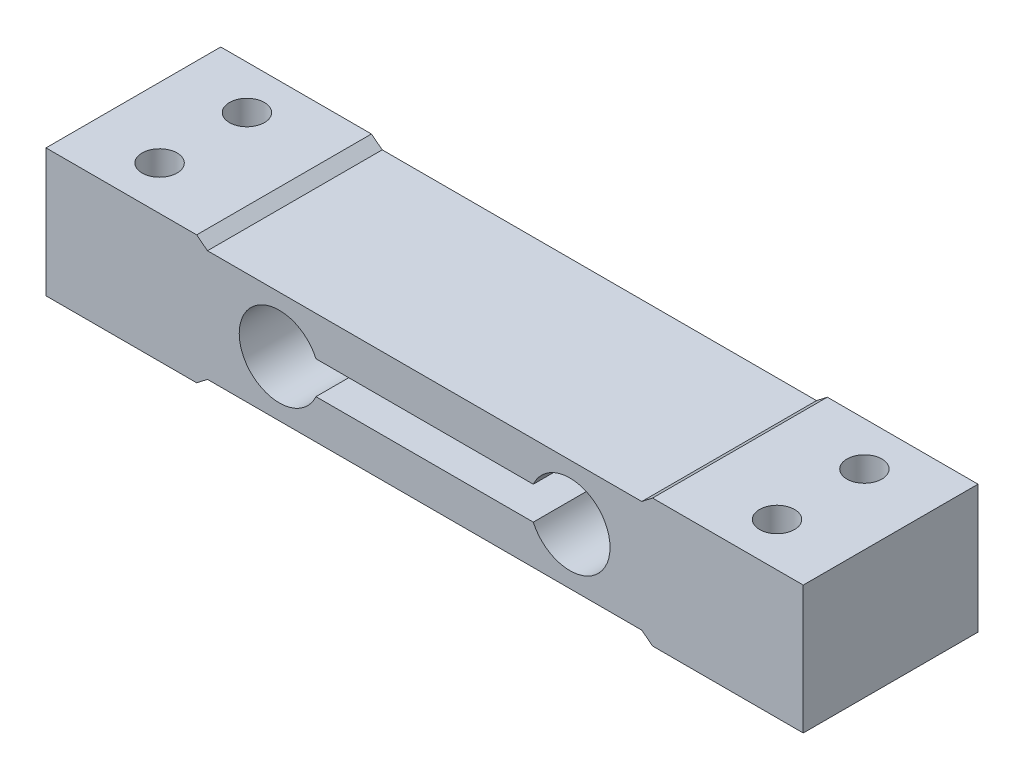
ISO-10303-21;
HEADER;
FILE_DESCRIPTION(('STEP AP214'),'2;1');
FILE_NAME('part.step','',(''),(''),'','','');
FILE_SCHEMA(('AUTOMOTIVE_DESIGN { 1 0 10303 214 1 1 1 1 }'));
ENDSEC;
DATA;
#1=APPLICATION_CONTEXT('core data for automotive mechanical design processes');
#2=APPLICATION_PROTOCOL_DEFINITION('international standard','automotive_design',2000,#1);
#3=PRODUCT_CONTEXT('',#1,'mechanical');
#4=PRODUCT('Part','Part','',(#3));
#5=PRODUCT_RELATED_PRODUCT_CATEGORY('part','',(#4));
#6=PRODUCT_DEFINITION_FORMATION('','',#4);
#7=PRODUCT_DEFINITION_CONTEXT('part definition',#1,'design');
#8=PRODUCT_DEFINITION('design','',#6,#7);
#9=PRODUCT_DEFINITION_SHAPE('','',#8);
#10=(LENGTH_UNIT() NAMED_UNIT(*) SI_UNIT(.MILLI.,.METRE.));
#11=(NAMED_UNIT(*) PLANE_ANGLE_UNIT() SI_UNIT($,.RADIAN.));
#12=(NAMED_UNIT(*) SI_UNIT($,.STERADIAN.) SOLID_ANGLE_UNIT());
#13=UNCERTAINTY_MEASURE_WITH_UNIT(LENGTH_MEASURE(1.E-05),#10,'distance_accuracy_value','');
#14=(GEOMETRIC_REPRESENTATION_CONTEXT(3) GLOBAL_UNCERTAINTY_ASSIGNED_CONTEXT((#13)) GLOBAL_UNIT_ASSIGNED_CONTEXT((#10,
#11,#12)) REPRESENTATION_CONTEXT('',''));
#15=CARTESIAN_POINT('',(0.,0.,0.));
#16=DIRECTION('',(0.,0.,1.));
#17=DIRECTION('',(1.,0.,0.));
#18=AXIS2_PLACEMENT_3D('',#15,#16,#17);
#19=CARTESIAN_POINT('',(-39.13,11.,15.));
#20=DIRECTION('',(0.,-1.,0.));
#21=DIRECTION('',(0.,0.,-1.));
#22=AXIS2_PLACEMENT_3D('',#19,#20,#21);
#23=PLANE('',#22);
#24=DIRECTION('',(-1.,0.,0.));
#25=VECTOR('',#24,1.);
#26=CARTESIAN_POINT('',(-39.13,11.,-15.));
#27=LINE('',#26,#25);
#28=CARTESIAN_POINT('',(-39.13,11.,-15.));
#29=VERTEX_POINT('',#28);
#30=CARTESIAN_POINT('',(-65.,11.,-15.));
#31=VERTEX_POINT('',#30);
#32=EDGE_CURVE('E161',#29,#31,#27,.T.);
#33=ORIENTED_EDGE('',*,*,#32,.T.);
#34=DIRECTION('',(0.,0.,-1.));
#35=VECTOR('',#34,1.);
#36=CARTESIAN_POINT('',(-65.,11.,15.));
#37=LINE('',#36,#35);
#38=CARTESIAN_POINT('',(-65.,11.,15.));
#39=VERTEX_POINT('',#38);
#40=EDGE_CURVE('E11',#39,#31,#37,.T.);
#41=ORIENTED_EDGE('',*,*,#40,.F.);
#42=DIRECTION('',(-1.,0.,0.));
#43=VECTOR('',#42,1.);
#44=CARTESIAN_POINT('',(-39.13,11.,15.));
#45=LINE('',#44,#43);
#46=CARTESIAN_POINT('',(-39.13,11.,15.));
#47=VERTEX_POINT('',#46);
#48=EDGE_CURVE('E186',#47,#39,#45,.T.);
#49=ORIENTED_EDGE('',*,*,#48,.F.);
#50=DIRECTION('',(0.,0.,-1.));
#51=VECTOR('',#50,1.);
#52=CARTESIAN_POINT('',(-39.13,11.,15.));
#53=LINE('',#52,#51);
#54=EDGE_CURVE('E212',#47,#29,#53,.T.);
#55=ORIENTED_EDGE('',*,*,#54,.T.);
#56=EDGE_LOOP('',(#33,#41,#49,#55));
#57=FACE_BOUND('',#56,.T.);
#58=CARTESIAN_POINT('',(-53.,11.,7.50000000000003));
#59=DIRECTION('',(0.,-1.,0.));
#60=DIRECTION('',(0.,0.,-1.));
#61=AXIS2_PLACEMENT_3D('',#58,#59,#60);
#62=CIRCLE('',#61,3.);
#63=CARTESIAN_POINT('',(-53.,11.,4.50000000000002));
#64=VERTEX_POINT('',#63);
#65=EDGE_CURVE('E526',#64,#64,#62,.T.);
#66=ORIENTED_EDGE('',*,*,#65,.T.);
#67=EDGE_LOOP('',(#66));
#68=FACE_BOUND('',#67,.T.);
#69=CARTESIAN_POINT('',(-53.,11.,-7.50000000000003));
#70=DIRECTION('',(0.,1.,0.));
#71=DIRECTION('',(0.,0.,1.));
#72=AXIS2_PLACEMENT_3D('',#69,#70,#71);
#73=CIRCLE('',#72,3.);
#74=CARTESIAN_POINT('',(-53.,11.,-4.50000000000002));
#75=VERTEX_POINT('',#74);
#76=EDGE_CURVE('E524',#75,#75,#73,.T.);
#77=ORIENTED_EDGE('',*,*,#76,.F.);
#78=EDGE_LOOP('',(#77));
#79=FACE_BOUND('',#78,.T.);
#80=ADVANCED_FACE('F37',(#57,#68,#79),#23,.F.);
#81=CARTESIAN_POINT('',(-65.,-11.,15.));
#82=DIRECTION('',(0.,1.,0.));
#83=DIRECTION('',(0.,0.,1.));
#84=AXIS2_PLACEMENT_3D('',#81,#82,#83);
#85=PLANE('',#84);
#86=DIRECTION('',(1.,0.,0.));
#87=VECTOR('',#86,1.);
#88=CARTESIAN_POINT('',(-65.,-11.,-15.));
#89=LINE('',#88,#87);
#90=CARTESIAN_POINT('',(-65.,-11.,-15.));
#91=VERTEX_POINT('',#90);
#92=CARTESIAN_POINT('',(-39.13,-11.,-15.));
#93=VERTEX_POINT('',#92);
#94=EDGE_CURVE('E217',#91,#93,#89,.T.);
#95=ORIENTED_EDGE('',*,*,#94,.T.);
#96=DIRECTION('',(0.,0.,-1.));
#97=VECTOR('',#96,1.);
#98=CARTESIAN_POINT('',(-39.13,-11.,15.));
#99=LINE('',#98,#97);
#100=CARTESIAN_POINT('',(-39.13,-11.,15.));
#101=VERTEX_POINT('',#100);
#102=EDGE_CURVE('E262',#101,#93,#99,.T.);
#103=ORIENTED_EDGE('',*,*,#102,.F.);
#104=DIRECTION('',(1.,0.,0.));
#105=VECTOR('',#104,1.);
#106=CARTESIAN_POINT('',(-65.,-11.,15.));
#107=LINE('',#106,#105);
#108=CARTESIAN_POINT('',(-65.,-11.,15.));
#109=VERTEX_POINT('',#108);
#110=EDGE_CURVE('E192',#109,#101,#107,.T.);
#111=ORIENTED_EDGE('',*,*,#110,.F.);
#112=DIRECTION('',(0.,0.,-1.));
#113=VECTOR('',#112,1.);
#114=CARTESIAN_POINT('',(-65.,-11.,15.));
#115=LINE('',#114,#113);
#116=EDGE_CURVE('E44',#109,#91,#115,.T.);
#117=ORIENTED_EDGE('',*,*,#116,.T.);
#118=EDGE_LOOP('',(#95,#103,#111,#117));
#119=FACE_BOUND('',#118,.T.);
#120=CARTESIAN_POINT('',(-53.,-11.,7.50000000000003));
#121=DIRECTION('',(0.,-1.,0.));
#122=DIRECTION('',(0.,0.,-1.));
#123=AXIS2_PLACEMENT_3D('',#120,#121,#122);
#124=CIRCLE('',#123,3.);
#125=CARTESIAN_POINT('',(-53.,-11.,4.50000000000002));
#126=VERTEX_POINT('',#125);
#127=EDGE_CURVE('E175',#126,#126,#124,.T.);
#128=ORIENTED_EDGE('',*,*,#127,.F.);
#129=EDGE_LOOP('',(#128));
#130=FACE_BOUND('',#129,.T.);
#131=CARTESIAN_POINT('',(-53.,-11.,-7.50000000000003));
#132=DIRECTION('',(0.,1.,0.));
#133=DIRECTION('',(0.,0.,1.));
#134=AXIS2_PLACEMENT_3D('',#131,#132,#133);
#135=CIRCLE('',#134,3.);
#136=CARTESIAN_POINT('',(-53.,-11.,-4.50000000000002));
#137=VERTEX_POINT('',#136);
#138=EDGE_CURVE('E521',#137,#137,#135,.T.);
#139=ORIENTED_EDGE('',*,*,#138,.T.);
#140=EDGE_LOOP('',(#139));
#141=FACE_BOUND('',#140,.T.);
#142=ADVANCED_FACE('F269',(#119,#130,#141),#85,.F.);
#143=CARTESIAN_POINT('',(39.13,-11.,15.));
#144=DIRECTION('',(0.,1.,0.));
#145=DIRECTION('',(0.,0.,1.));
#146=AXIS2_PLACEMENT_3D('',#143,#144,#145);
#147=PLANE('',#146);
#148=DIRECTION('',(1.,0.,0.));
#149=VECTOR('',#148,1.);
#150=CARTESIAN_POINT('',(39.13,-11.,-15.));
#151=LINE('',#150,#149);
#152=CARTESIAN_POINT('',(39.13,-11.,-15.));
#153=VERTEX_POINT('',#152);
#154=CARTESIAN_POINT('',(65.,-11.,-15.));
#155=VERTEX_POINT('',#154);
#156=EDGE_CURVE('E225',#153,#155,#151,.T.);
#157=ORIENTED_EDGE('',*,*,#156,.T.);
#158=DIRECTION('',(0.,0.,-1.));
#159=VECTOR('',#158,1.);
#160=CARTESIAN_POINT('',(65.,-11.,15.));
#161=LINE('',#160,#159);
#162=CARTESIAN_POINT('',(65.,-11.,15.));
#163=VERTEX_POINT('',#162);
#164=EDGE_CURVE('E250',#163,#155,#161,.T.);
#165=ORIENTED_EDGE('',*,*,#164,.F.);
#166=DIRECTION('',(1.,0.,0.));
#167=VECTOR('',#166,1.);
#168=CARTESIAN_POINT('',(39.13,-11.,15.));
#169=LINE('',#168,#167);
#170=CARTESIAN_POINT('',(39.13,-11.,15.));
#171=VERTEX_POINT('',#170);
#172=EDGE_CURVE('E200',#171,#163,#169,.T.);
#173=ORIENTED_EDGE('',*,*,#172,.F.);
#174=DIRECTION('',(0.,0.,-1.));
#175=VECTOR('',#174,1.);
#176=CARTESIAN_POINT('',(39.13,-11.,15.));
#177=LINE('',#176,#175);
#178=EDGE_CURVE('E253',#171,#153,#177,.T.);
#179=ORIENTED_EDGE('',*,*,#178,.T.);
#180=EDGE_LOOP('',(#157,#165,#173,#179));
#181=FACE_BOUND('',#180,.T.);
#182=CARTESIAN_POINT('',(53.,-11.,-7.50000000000004));
#183=DIRECTION('',(0.,-1.,0.));
#184=DIRECTION('',(0.,0.,-1.));
#185=AXIS2_PLACEMENT_3D('',#182,#183,#184);
#186=CIRCLE('',#185,3.);
#187=CARTESIAN_POINT('',(53.,-11.,-10.5));
#188=VERTEX_POINT('',#187);
#189=EDGE_CURVE('E532',#188,#188,#186,.T.);
#190=ORIENTED_EDGE('',*,*,#189,.F.);
#191=EDGE_LOOP('',(#190));
#192=FACE_BOUND('',#191,.T.);
#193=CARTESIAN_POINT('',(53.,-11.,7.50000000000001));
#194=DIRECTION('',(0.,1.,0.));
#195=DIRECTION('',(0.,0.,1.));
#196=AXIS2_PLACEMENT_3D('',#193,#194,#195);
#197=CIRCLE('',#196,3.);
#198=CARTESIAN_POINT('',(53.,-11.,10.5));
#199=VERTEX_POINT('',#198);
#200=EDGE_CURVE('E537',#199,#199,#197,.T.);
#201=ORIENTED_EDGE('',*,*,#200,.T.);
#202=EDGE_LOOP('',(#201));
#203=FACE_BOUND('',#202,.T.);
#204=ADVANCED_FACE('F326',(#181,#192,#203),#147,.F.);
#205=CARTESIAN_POINT('',(65.,11.,15.));
#206=DIRECTION('',(0.,-1.,0.));
#207=DIRECTION('',(0.,0.,-1.));
#208=AXIS2_PLACEMENT_3D('',#205,#206,#207);
#209=PLANE('',#208);
#210=DIRECTION('',(-1.,0.,0.));
#211=VECTOR('',#210,1.);
#212=CARTESIAN_POINT('',(65.,11.,-15.));
#213=LINE('',#212,#211);
#214=CARTESIAN_POINT('',(65.,11.,-15.));
#215=VERTEX_POINT('',#214);
#216=CARTESIAN_POINT('',(39.13,11.,-15.));
#217=VERTEX_POINT('',#216);
#218=EDGE_CURVE('E229',#215,#217,#213,.T.);
#219=ORIENTED_EDGE('',*,*,#218,.T.);
#220=DIRECTION('',(0.,0.,-1.));
#221=VECTOR('',#220,1.);
#222=CARTESIAN_POINT('',(39.13,11.,15.));
#223=LINE('',#222,#221);
#224=CARTESIAN_POINT('',(39.13,11.,15.));
#225=VERTEX_POINT('',#224);
#226=EDGE_CURVE('E244',#225,#217,#223,.T.);
#227=ORIENTED_EDGE('',*,*,#226,.F.);
#228=DIRECTION('',(-1.,0.,0.));
#229=VECTOR('',#228,1.);
#230=CARTESIAN_POINT('',(65.,11.,15.));
#231=LINE('',#230,#229);
#232=CARTESIAN_POINT('',(65.,11.,15.));
#233=VERTEX_POINT('',#232);
#234=EDGE_CURVE('E204',#233,#225,#231,.T.);
#235=ORIENTED_EDGE('',*,*,#234,.F.);
#236=DIRECTION('',(0.,0.,-1.));
#237=VECTOR('',#236,1.);
#238=CARTESIAN_POINT('',(65.,11.,15.));
#239=LINE('',#238,#237);
#240=EDGE_CURVE('E247',#233,#215,#239,.T.);
#241=ORIENTED_EDGE('',*,*,#240,.T.);
#242=EDGE_LOOP('',(#219,#227,#235,#241));
#243=FACE_BOUND('',#242,.T.);
#244=CARTESIAN_POINT('',(53.,11.,-7.50000000000004));
#245=DIRECTION('',(0.,-1.,0.));
#246=DIRECTION('',(0.,0.,-1.));
#247=AXIS2_PLACEMENT_3D('',#244,#245,#246);
#248=CIRCLE('',#247,3.);
#249=CARTESIAN_POINT('',(53.,11.,-10.5));
#250=VERTEX_POINT('',#249);
#251=EDGE_CURVE('E540',#250,#250,#248,.T.);
#252=ORIENTED_EDGE('',*,*,#251,.T.);
#253=EDGE_LOOP('',(#252));
#254=FACE_BOUND('',#253,.T.);
#255=CARTESIAN_POINT('',(53.,11.,7.50000000000001));
#256=DIRECTION('',(0.,1.,0.));
#257=DIRECTION('',(0.,0.,1.));
#258=AXIS2_PLACEMENT_3D('',#255,#256,#257);
#259=CIRCLE('',#258,3.);
#260=CARTESIAN_POINT('',(53.,11.,10.5));
#261=VERTEX_POINT('',#260);
#262=EDGE_CURVE('E529',#261,#261,#259,.T.);
#263=ORIENTED_EDGE('',*,*,#262,.F.);
#264=EDGE_LOOP('',(#263));
#265=FACE_BOUND('',#264,.T.);
#266=ADVANCED_FACE('F316',(#243,#254,#265),#209,.F.);
#267=CARTESIAN_POINT('',(0.,0.,15.));
#268=DIRECTION('',(0.,0.,1.));
#269=DIRECTION('',(1.,0.,0.));
#270=AXIS2_PLACEMENT_3D('',#267,#268,#269);
#271=PLANE('',#270);
#272=ORIENTED_EDGE('',*,*,#48,.T.);
#273=DIRECTION('',(0.,-1.,0.));
#274=VECTOR('',#273,1.);
#275=CARTESIAN_POINT('',(-65.,11.,15.));
#276=LINE('',#275,#274);
#277=EDGE_CURVE('E189',#39,#109,#276,.T.);
#278=ORIENTED_EDGE('',*,*,#277,.T.);
#279=ORIENTED_EDGE('',*,*,#110,.T.);
#280=DIRECTION('',(0.79015648004113,0.612905161545416,0.));
#281=VECTOR('',#280,1.);
#282=CARTESIAN_POINT('',(-39.13,-11.,15.));
#283=LINE('',#282,#281);
#284=CARTESIAN_POINT('',(-37.28,-9.565,15.));
#285=VERTEX_POINT('',#284);
#286=EDGE_CURVE('E194',#101,#285,#283,.T.);
#287=ORIENTED_EDGE('',*,*,#286,.T.);
#288=DIRECTION('',(1.,0.,0.));
#289=VECTOR('',#288,1.);
#290=CARTESIAN_POINT('',(-37.28,-9.565,15.));
#291=LINE('',#290,#289);
#292=CARTESIAN_POINT('',(37.28,-9.565,15.));
#293=VERTEX_POINT('',#292);
#294=EDGE_CURVE('E196',#285,#293,#291,.T.);
#295=ORIENTED_EDGE('',*,*,#294,.T.);
#296=DIRECTION('',(0.79015648004113,-0.612905161545416,0.));
#297=VECTOR('',#296,1.);
#298=CARTESIAN_POINT('',(37.28,-9.565,15.));
#299=LINE('',#298,#297);
#300=EDGE_CURVE('E198',#293,#171,#299,.T.);
#301=ORIENTED_EDGE('',*,*,#300,.T.);
#302=ORIENTED_EDGE('',*,*,#172,.T.);
#303=DIRECTION('',(0.,1.,0.));
#304=VECTOR('',#303,1.);
#305=CARTESIAN_POINT('',(65.,-11.,15.));
#306=LINE('',#305,#304);
#307=EDGE_CURVE('E202',#163,#233,#306,.T.);
#308=ORIENTED_EDGE('',*,*,#307,.T.);
#309=ORIENTED_EDGE('',*,*,#234,.T.);
#310=DIRECTION('',(-0.79015648004113,-0.612905161545416,0.));
#311=VECTOR('',#310,1.);
#312=CARTESIAN_POINT('',(39.13,11.,15.));
#313=LINE('',#312,#311);
#314=CARTESIAN_POINT('',(37.28,9.565,15.));
#315=VERTEX_POINT('',#314);
#316=EDGE_CURVE('E206',#225,#315,#313,.T.);
#317=ORIENTED_EDGE('',*,*,#316,.T.);
#318=DIRECTION('',(-1.,0.,0.));
#319=VECTOR('',#318,1.);
#320=CARTESIAN_POINT('',(37.28,9.565,15.));
#321=LINE('',#320,#319);
#322=CARTESIAN_POINT('',(-37.28,9.565,15.));
#323=VERTEX_POINT('',#322);
#324=EDGE_CURVE('E208',#315,#323,#321,.T.);
#325=ORIENTED_EDGE('',*,*,#324,.T.);
#326=DIRECTION('',(-0.79015648004113,0.612905161545416,0.));
#327=VECTOR('',#326,1.);
#328=CARTESIAN_POINT('',(-37.28,9.565,15.));
#329=LINE('',#328,#327);
#330=EDGE_CURVE('E210',#323,#47,#329,.T.);
#331=ORIENTED_EDGE('',*,*,#330,.T.);
#332=EDGE_LOOP('',(#272,#278,#279,#287,#295,#301,#302,#308,#309,#317,#325,#331));
#333=FACE_BOUND('',#332,.T.);
#334=DIRECTION('',(1.,0.,0.));
#335=VECTOR('',#334,1.);
#336=CARTESIAN_POINT('',(-18.655,-2.81499999999998,15.));
#337=LINE('',#336,#335);
#338=CARTESIAN_POINT('',(-18.655,-2.81499999999998,15.));
#339=VERTEX_POINT('',#338);
#340=CARTESIAN_POINT('',(18.655,-2.81499999999998,15.));
#341=VERTEX_POINT('',#340);
#342=EDGE_CURVE('E166',#339,#341,#337,.T.);
#343=ORIENTED_EDGE('',*,*,#342,.F.);
#344=CARTESIAN_POINT('',(-24.941770398482,0.,15.));
#345=DIRECTION('',(0.,0.,1.));
#346=DIRECTION('',(1.,0.,0.));
#347=AXIS2_PLACEMENT_3D('',#344,#345,#346);
#348=CIRCLE('',#347,6.88822960151802);
#349=CARTESIAN_POINT('',(-18.655,2.81500000000002,15.));
#350=VERTEX_POINT('',#349);
#351=EDGE_CURVE('E151',#350,#339,#348,.T.);
#352=ORIENTED_EDGE('',*,*,#351,.F.);
#353=DIRECTION('',(-1.,0.,0.));
#354=VECTOR('',#353,1.);
#355=CARTESIAN_POINT('',(0.,2.81500000000002,15.));
#356=LINE('',#355,#354);
#357=CARTESIAN_POINT('',(18.655,2.81500000000002,15.));
#358=VERTEX_POINT('',#357);
#359=EDGE_CURVE('E146',#358,#350,#356,.T.);
#360=ORIENTED_EDGE('',*,*,#359,.F.);
#361=CARTESIAN_POINT('',(24.941770398482,0.,15.));
#362=DIRECTION('',(0.,0.,1.));
#363=DIRECTION('',(-1.,0.,0.));
#364=AXIS2_PLACEMENT_3D('',#361,#362,#363);
#365=CIRCLE('',#364,6.88822960151803);
#366=EDGE_CURVE('E168',#341,#358,#365,.T.);
#367=ORIENTED_EDGE('',*,*,#366,.F.);
#368=EDGE_LOOP('',(#343,#352,#360,#367));
#369=FACE_BOUND('',#368,.T.);
#370=ADVANCED_FACE('F165',(#333,#369),#271,.T.);
#371=CARTESIAN_POINT('',(0.,0.,-15.));
#372=DIRECTION('',(0.,0.,1.));
#373=DIRECTION('',(1.,0.,0.));
#374=AXIS2_PLACEMENT_3D('',#371,#372,#373);
#375=PLANE('',#374);
#376=ORIENTED_EDGE('',*,*,#32,.F.);
#377=DIRECTION('',(-0.79015648004113,0.612905161545416,0.));
#378=VECTOR('',#377,1.);
#379=CARTESIAN_POINT('',(-37.28,9.565,-15.));
#380=LINE('',#379,#378);
#381=CARTESIAN_POINT('',(-37.28,9.565,-15.));
#382=VERTEX_POINT('',#381);
#383=EDGE_CURVE('E190',#382,#29,#380,.T.);
#384=ORIENTED_EDGE('',*,*,#383,.F.);
#385=DIRECTION('',(-1.,0.,0.));
#386=VECTOR('',#385,1.);
#387=CARTESIAN_POINT('',(37.28,9.565,-15.));
#388=LINE('',#387,#386);
#389=CARTESIAN_POINT('',(37.28,9.565,-15.));
#390=VERTEX_POINT('',#389);
#391=EDGE_CURVE('E233',#390,#382,#388,.T.);
#392=ORIENTED_EDGE('',*,*,#391,.F.);
#393=DIRECTION('',(-0.79015648004113,-0.612905161545416,0.));
#394=VECTOR('',#393,1.);
#395=CARTESIAN_POINT('',(39.13,11.,-15.));
#396=LINE('',#395,#394);
#397=EDGE_CURVE('E231',#217,#390,#396,.T.);
#398=ORIENTED_EDGE('',*,*,#397,.F.);
#399=ORIENTED_EDGE('',*,*,#218,.F.);
#400=DIRECTION('',(0.,1.,0.));
#401=VECTOR('',#400,1.);
#402=CARTESIAN_POINT('',(65.,-11.,-15.));
#403=LINE('',#402,#401);
#404=EDGE_CURVE('E227',#155,#215,#403,.T.);
#405=ORIENTED_EDGE('',*,*,#404,.F.);
#406=ORIENTED_EDGE('',*,*,#156,.F.);
#407=DIRECTION('',(0.79015648004113,-0.612905161545416,0.));
#408=VECTOR('',#407,1.);
#409=CARTESIAN_POINT('',(37.28,-9.565,-15.));
#410=LINE('',#409,#408);
#411=CARTESIAN_POINT('',(37.28,-9.565,-15.));
#412=VERTEX_POINT('',#411);
#413=EDGE_CURVE('E223',#412,#153,#410,.T.);
#414=ORIENTED_EDGE('',*,*,#413,.F.);
#415=DIRECTION('',(1.,0.,0.));
#416=VECTOR('',#415,1.);
#417=CARTESIAN_POINT('',(-37.28,-9.565,-15.));
#418=LINE('',#417,#416);
#419=CARTESIAN_POINT('',(-37.28,-9.565,-15.));
#420=VERTEX_POINT('',#419);
#421=EDGE_CURVE('E221',#420,#412,#418,.T.);
#422=ORIENTED_EDGE('',*,*,#421,.F.);
#423=DIRECTION('',(0.79015648004113,0.612905161545416,0.));
#424=VECTOR('',#423,1.);
#425=CARTESIAN_POINT('',(-39.13,-11.,-15.));
#426=LINE('',#425,#424);
#427=EDGE_CURVE('E219',#93,#420,#426,.T.);
#428=ORIENTED_EDGE('',*,*,#427,.F.);
#429=ORIENTED_EDGE('',*,*,#94,.F.);
#430=DIRECTION('',(0.,-1.,0.));
#431=VECTOR('',#430,1.);
#432=CARTESIAN_POINT('',(-65.,11.,-15.));
#433=LINE('',#432,#431);
#434=EDGE_CURVE('E215',#31,#91,#433,.T.);
#435=ORIENTED_EDGE('',*,*,#434,.F.);
#436=EDGE_LOOP('',(#376,#384,#392,#398,#399,#405,#406,#414,#422,#428,#429,#435));
#437=FACE_BOUND('',#436,.T.);
#438=CARTESIAN_POINT('',(-24.941770398482,0.,-15.));
#439=DIRECTION('',(0.,0.,1.));
#440=DIRECTION('',(1.,0.,0.));
#441=AXIS2_PLACEMENT_3D('',#438,#439,#440);
#442=CIRCLE('',#441,6.88822960151802);
#443=CARTESIAN_POINT('',(-18.655,2.81500000000003,-15.));
#444=VERTEX_POINT('',#443);
#445=CARTESIAN_POINT('',(-18.655,-2.81499999999998,-15.));
#446=VERTEX_POINT('',#445);
#447=EDGE_CURVE('E159',#444,#446,#442,.T.);
#448=ORIENTED_EDGE('',*,*,#447,.T.);
#449=DIRECTION('',(1.,0.,0.));
#450=VECTOR('',#449,1.);
#451=CARTESIAN_POINT('',(18.655,-2.81499999999998,-15.));
#452=LINE('',#451,#450);
#453=CARTESIAN_POINT('',(18.655,-2.81499999999998,-15.));
#454=VERTEX_POINT('',#453);
#455=EDGE_CURVE('E174',#446,#454,#452,.T.);
#456=ORIENTED_EDGE('',*,*,#455,.T.);
#457=CARTESIAN_POINT('',(24.941770398482,0.,-15.));
#458=DIRECTION('',(0.,0.,1.));
#459=DIRECTION('',(-1.,0.,0.));
#460=AXIS2_PLACEMENT_3D('',#457,#458,#459);
#461=CIRCLE('',#460,6.88822960151803);
#462=CARTESIAN_POINT('',(18.655,2.81500000000002,-15.));
#463=VERTEX_POINT('',#462);
#464=EDGE_CURVE('E178',#454,#463,#461,.T.);
#465=ORIENTED_EDGE('',*,*,#464,.T.);
#466=DIRECTION('',(-1.,0.,0.));
#467=VECTOR('',#466,1.);
#468=CARTESIAN_POINT('',(0.,2.81500000000002,-15.));
#469=LINE('',#468,#467);
#470=EDGE_CURVE('E152',#463,#444,#469,.T.);
#471=ORIENTED_EDGE('',*,*,#470,.T.);
#472=EDGE_LOOP('',(#448,#456,#465,#471));
#473=FACE_BOUND('',#472,.T.);
#474=ADVANCED_FACE('F276',(#437,#473),#375,.F.);
#475=CARTESIAN_POINT('',(-65.,11.,15.));
#476=DIRECTION('',(1.,0.,0.));
#477=DIRECTION('',(0.,0.,-1.));
#478=AXIS2_PLACEMENT_3D('',#475,#476,#477);
#479=PLANE('',#478);
#480=ORIENTED_EDGE('',*,*,#434,.T.);
#481=ORIENTED_EDGE('',*,*,#116,.F.);
#482=ORIENTED_EDGE('',*,*,#277,.F.);
#483=ORIENTED_EDGE('',*,*,#40,.T.);
#484=EDGE_LOOP('',(#480,#481,#482,#483));
#485=FACE_BOUND('',#484,.T.);
#486=ADVANCED_FACE('F293',(#485),#479,.F.);
#487=CARTESIAN_POINT('',(-39.13,-11.,15.));
#488=DIRECTION('',(-0.612905161545415,0.79015648004113,0.));
#489=DIRECTION('',(-0.79015648004113,-0.612905161545416,0.));
#490=AXIS2_PLACEMENT_3D('',#487,#488,#489);
#491=PLANE('',#490);
#492=ORIENTED_EDGE('',*,*,#427,.T.);
#493=DIRECTION('',(0.,0.,-1.));
#494=VECTOR('',#493,1.);
#495=CARTESIAN_POINT('',(-37.28,-9.565,15.));
#496=LINE('',#495,#494);
#497=EDGE_CURVE('E259',#285,#420,#496,.T.);
#498=ORIENTED_EDGE('',*,*,#497,.F.);
#499=ORIENTED_EDGE('',*,*,#286,.F.);
#500=ORIENTED_EDGE('',*,*,#102,.T.);
#501=EDGE_LOOP('',(#492,#498,#499,#500));
#502=FACE_BOUND('',#501,.T.);
#503=ADVANCED_FACE('F282',(#502),#491,.F.);
#504=CARTESIAN_POINT('',(-37.28,-9.565,15.));
#505=DIRECTION('',(0.,1.,0.));
#506=DIRECTION('',(0.,0.,1.));
#507=AXIS2_PLACEMENT_3D('',#504,#505,#506);
#508=PLANE('',#507);
#509=ORIENTED_EDGE('',*,*,#421,.T.);
#510=DIRECTION('',(0.,0.,-1.));
#511=VECTOR('',#510,1.);
#512=CARTESIAN_POINT('',(37.28,-9.565,15.));
#513=LINE('',#512,#511);
#514=EDGE_CURVE('E256',#293,#412,#513,.T.);
#515=ORIENTED_EDGE('',*,*,#514,.F.);
#516=ORIENTED_EDGE('',*,*,#294,.F.);
#517=ORIENTED_EDGE('',*,*,#497,.T.);
#518=EDGE_LOOP('',(#509,#515,#516,#517));
#519=FACE_BOUND('',#518,.T.);
#520=ADVANCED_FACE('F286',(#519),#508,.F.);
#521=CARTESIAN_POINT('',(37.28,-9.565,15.));
#522=DIRECTION('',(0.612905161545415,0.79015648004113,0.));
#523=DIRECTION('',(-0.79015648004113,0.612905161545416,0.));
#524=AXIS2_PLACEMENT_3D('',#521,#522,#523);
#525=PLANE('',#524);
#526=ORIENTED_EDGE('',*,*,#413,.T.);
#527=ORIENTED_EDGE('',*,*,#178,.F.);
#528=ORIENTED_EDGE('',*,*,#300,.F.);
#529=ORIENTED_EDGE('',*,*,#514,.T.);
#530=EDGE_LOOP('',(#526,#527,#528,#529));
#531=FACE_BOUND('',#530,.T.);
#532=ADVANCED_FACE('F329',(#531),#525,.F.);
#533=CARTESIAN_POINT('',(65.,-11.,15.));
#534=DIRECTION('',(-1.,0.,0.));
#535=DIRECTION('',(0.,0.,1.));
#536=AXIS2_PLACEMENT_3D('',#533,#534,#535);
#537=PLANE('',#536);
#538=ORIENTED_EDGE('',*,*,#404,.T.);
#539=ORIENTED_EDGE('',*,*,#240,.F.);
#540=ORIENTED_EDGE('',*,*,#307,.F.);
#541=ORIENTED_EDGE('',*,*,#164,.T.);
#542=EDGE_LOOP('',(#538,#539,#540,#541));
#543=FACE_BOUND('',#542,.T.);
#544=ADVANCED_FACE('F322',(#543),#537,.F.);
#545=CARTESIAN_POINT('',(39.13,11.,15.));
#546=DIRECTION('',(0.612905161545415,-0.79015648004113,0.));
#547=DIRECTION('',(0.79015648004113,0.612905161545416,0.));
#548=AXIS2_PLACEMENT_3D('',#545,#546,#547);
#549=PLANE('',#548);
#550=ORIENTED_EDGE('',*,*,#397,.T.);
#551=DIRECTION('',(0.,0.,-1.));
#552=VECTOR('',#551,1.);
#553=CARTESIAN_POINT('',(37.28,9.565,15.));
#554=LINE('',#553,#552);
#555=EDGE_CURVE('E241',#315,#390,#554,.T.);
#556=ORIENTED_EDGE('',*,*,#555,.F.);
#557=ORIENTED_EDGE('',*,*,#316,.F.);
#558=ORIENTED_EDGE('',*,*,#226,.T.);
#559=EDGE_LOOP('',(#550,#556,#557,#558));
#560=FACE_BOUND('',#559,.T.);
#561=ADVANCED_FACE('F310',(#560),#549,.F.);
#562=CARTESIAN_POINT('',(37.28,9.565,15.));
#563=DIRECTION('',(0.,-1.,0.));
#564=DIRECTION('',(0.,0.,-1.));
#565=AXIS2_PLACEMENT_3D('',#562,#563,#564);
#566=PLANE('',#565);
#567=ORIENTED_EDGE('',*,*,#391,.T.);
#568=DIRECTION('',(0.,0.,-1.));
#569=VECTOR('',#568,1.);
#570=CARTESIAN_POINT('',(-37.28,9.565,15.));
#571=LINE('',#570,#569);
#572=EDGE_CURVE('E238',#323,#382,#571,.T.);
#573=ORIENTED_EDGE('',*,*,#572,.F.);
#574=ORIENTED_EDGE('',*,*,#324,.F.);
#575=ORIENTED_EDGE('',*,*,#555,.T.);
#576=EDGE_LOOP('',(#567,#573,#574,#575));
#577=FACE_BOUND('',#576,.T.);
#578=ADVANCED_FACE('F306',(#577),#566,.F.);
#579=CARTESIAN_POINT('',(-37.28,9.565,15.));
#580=DIRECTION('',(-0.612905161545415,-0.79015648004113,0.));
#581=DIRECTION('',(0.79015648004113,-0.612905161545416,0.));
#582=AXIS2_PLACEMENT_3D('',#579,#580,#581);
#583=PLANE('',#582);
#584=ORIENTED_EDGE('',*,*,#383,.T.);
#585=ORIENTED_EDGE('',*,*,#54,.F.);
#586=ORIENTED_EDGE('',*,*,#330,.F.);
#587=ORIENTED_EDGE('',*,*,#572,.T.);
#588=EDGE_LOOP('',(#584,#585,#586,#587));
#589=FACE_BOUND('',#588,.T.);
#590=ADVANCED_FACE('F301',(#589),#583,.F.);
#591=CARTESIAN_POINT('',(-24.941770398482,0.,15.));
#592=DIRECTION('',(0.,0.,-1.));
#593=DIRECTION('',(-1.,0.,0.));
#594=AXIS2_PLACEMENT_3D('',#591,#592,#593);
#595=CYLINDRICAL_SURFACE('',#594,6.88822960151802);
#596=ORIENTED_EDGE('',*,*,#447,.F.);
#597=DIRECTION('',(0.,0.,-1.));
#598=VECTOR('',#597,1.);
#599=CARTESIAN_POINT('',(-18.655,2.81500000000002,15.));
#600=LINE('',#599,#598);
#601=EDGE_CURVE('E56',#350,#444,#600,.T.);
#602=ORIENTED_EDGE('',*,*,#601,.F.);
#603=ORIENTED_EDGE('',*,*,#351,.T.);
#604=DIRECTION('',(0.,0.,-1.));
#605=VECTOR('',#604,1.);
#606=CARTESIAN_POINT('',(-18.655,-2.81499999999998,15.));
#607=LINE('',#606,#605);
#608=EDGE_CURVE('E162',#339,#446,#607,.T.);
#609=ORIENTED_EDGE('',*,*,#608,.T.);
#610=EDGE_LOOP('',(#596,#602,#603,#609));
#611=FACE_BOUND('',#610,.T.);
#612=ADVANCED_FACE('F155',(#611),#595,.F.);
#613=CARTESIAN_POINT('',(18.655,-2.81499999999998,15.));
#614=DIRECTION('',(0.,1.,0.));
#615=DIRECTION('',(-1.,0.,0.));
#616=AXIS2_PLACEMENT_3D('',#613,#614,#615);
#617=PLANE('',#616);
#618=ORIENTED_EDGE('',*,*,#455,.F.);
#619=ORIENTED_EDGE('',*,*,#608,.F.);
#620=ORIENTED_EDGE('',*,*,#342,.T.);
#621=DIRECTION('',(0.,0.,-1.));
#622=VECTOR('',#621,1.);
#623=CARTESIAN_POINT('',(18.655,-2.81499999999998,15.));
#624=LINE('',#623,#622);
#625=EDGE_CURVE('E183',#341,#454,#624,.T.);
#626=ORIENTED_EDGE('',*,*,#625,.T.);
#627=EDGE_LOOP('',(#618,#619,#620,#626));
#628=FACE_BOUND('',#627,.T.);
#629=ADVANCED_FACE('F433',(#628),#617,.T.);
#630=CARTESIAN_POINT('',(24.941770398482,0.,15.));
#631=DIRECTION('',(0.,0.,-1.));
#632=DIRECTION('',(-1.,0.,0.));
#633=AXIS2_PLACEMENT_3D('',#630,#631,#632);
#634=CYLINDRICAL_SURFACE('',#633,6.88822960151803);
#635=ORIENTED_EDGE('',*,*,#464,.F.);
#636=ORIENTED_EDGE('',*,*,#625,.F.);
#637=ORIENTED_EDGE('',*,*,#366,.T.);
#638=DIRECTION('',(0.,0.,-1.));
#639=VECTOR('',#638,1.);
#640=CARTESIAN_POINT('',(18.655,2.81500000000002,15.));
#641=LINE('',#640,#639);
#642=EDGE_CURVE('E51',#358,#463,#641,.T.);
#643=ORIENTED_EDGE('',*,*,#642,.T.);
#644=EDGE_LOOP('',(#635,#636,#637,#643));
#645=FACE_BOUND('',#644,.T.);
#646=ADVANCED_FACE('F442',(#645),#634,.F.);
#647=CARTESIAN_POINT('',(0.,2.81500000000002,15.));
#648=DIRECTION('',(0.,-1.,0.));
#649=DIRECTION('',(1.,0.,0.));
#650=AXIS2_PLACEMENT_3D('',#647,#648,#649);
#651=PLANE('',#650);
#652=ORIENTED_EDGE('',*,*,#470,.F.);
#653=ORIENTED_EDGE('',*,*,#642,.F.);
#654=ORIENTED_EDGE('',*,*,#359,.T.);
#655=ORIENTED_EDGE('',*,*,#601,.T.);
#656=EDGE_LOOP('',(#652,#653,#654,#655));
#657=FACE_BOUND('',#656,.T.);
#658=ADVANCED_FACE('F147',(#657),#651,.T.);
#659=CARTESIAN_POINT('',(53.,-11.,-7.50000000000004));
#660=DIRECTION('',(0.,1.,0.));
#661=DIRECTION('',(0.,0.,1.));
#662=AXIS2_PLACEMENT_3D('',#659,#660,#661);
#663=CYLINDRICAL_SURFACE('',#662,3.);
#664=ORIENTED_EDGE('',*,*,#189,.T.);
#665=EDGE_LOOP('',(#664));
#666=FACE_BOUND('',#665,.T.);
#667=ORIENTED_EDGE('',*,*,#251,.F.);
#668=EDGE_LOOP('',(#667));
#669=FACE_BOUND('',#668,.T.);
#670=ADVANCED_FACE('F461',(#666,#669),#663,.F.);
#671=CARTESIAN_POINT('',(53.,-11.,7.50000000000001));
#672=DIRECTION('',(0.,1.,0.));
#673=DIRECTION('',(0.,0.,1.));
#674=AXIS2_PLACEMENT_3D('',#671,#672,#673);
#675=CYLINDRICAL_SURFACE('',#674,3.);
#676=ORIENTED_EDGE('',*,*,#200,.F.);
#677=EDGE_LOOP('',(#676));
#678=FACE_BOUND('',#677,.T.);
#679=ORIENTED_EDGE('',*,*,#262,.T.);
#680=EDGE_LOOP('',(#679));
#681=FACE_BOUND('',#680,.T.);
#682=ADVANCED_FACE('F485',(#678,#681),#675,.F.);
#683=CARTESIAN_POINT('',(-53.,-11.,7.50000000000003));
#684=DIRECTION('',(0.,1.,0.));
#685=DIRECTION('',(0.,0.,1.));
#686=AXIS2_PLACEMENT_3D('',#683,#684,#685);
#687=CYLINDRICAL_SURFACE('',#686,3.);
#688=ORIENTED_EDGE('',*,*,#127,.T.);
#689=EDGE_LOOP('',(#688));
#690=FACE_BOUND('',#689,.T.);
#691=ORIENTED_EDGE('',*,*,#65,.F.);
#692=EDGE_LOOP('',(#691));
#693=FACE_BOUND('',#692,.T.);
#694=ADVANCED_FACE('F494',(#690,#693),#687,.F.);
#695=CARTESIAN_POINT('',(-53.,-11.,-7.50000000000003));
#696=DIRECTION('',(0.,1.,0.));
#697=DIRECTION('',(0.,0.,1.));
#698=AXIS2_PLACEMENT_3D('',#695,#696,#697);
#699=CYLINDRICAL_SURFACE('',#698,3.);
#700=ORIENTED_EDGE('',*,*,#138,.F.);
#701=EDGE_LOOP('',(#700));
#702=FACE_BOUND('',#701,.T.);
#703=ORIENTED_EDGE('',*,*,#76,.T.);
#704=EDGE_LOOP('',(#703));
#705=FACE_BOUND('',#704,.T.);
#706=ADVANCED_FACE('F503',(#702,#705),#699,.F.);
#707=CLOSED_SHELL('',(#80,#142,#204,#266,#370,#474,#486,#503,#520,#532,#544,#561,#578,#590,#612,
#629,#646,#658,#670,#682,#694,#706));
#708=MANIFOLD_SOLID_BREP('B2',#707);
#709=ADVANCED_BREP_SHAPE_REPRESENTATION('',(#18,#708),#14);
#710=SHAPE_DEFINITION_REPRESENTATION(#9,#709);
ENDSEC;
END-ISO-10303-21;
